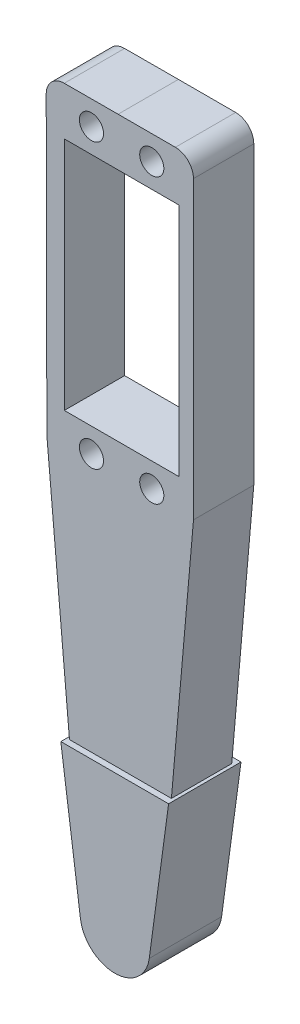
ISO-10303-21;
HEADER;
FILE_DESCRIPTION(('STEP AP214'),'2;1');
FILE_NAME('part.step','',(''),(''),'','','');
FILE_SCHEMA(('AUTOMOTIVE_DESIGN { 1 0 10303 214 1 1 1 1 }'));
ENDSEC;
DATA;
#1=APPLICATION_CONTEXT('core data for automotive mechanical design processes');
#2=APPLICATION_PROTOCOL_DEFINITION('international standard','automotive_design',2000,#1);
#3=PRODUCT_CONTEXT('',#1,'mechanical');
#4=PRODUCT('Part','Part','',(#3));
#5=PRODUCT_RELATED_PRODUCT_CATEGORY('part','',(#4));
#6=PRODUCT_DEFINITION_FORMATION('','',#4);
#7=PRODUCT_DEFINITION_CONTEXT('part definition',#1,'design');
#8=PRODUCT_DEFINITION('design','',#6,#7);
#9=PRODUCT_DEFINITION_SHAPE('','',#8);
#10=(LENGTH_UNIT() NAMED_UNIT(*) SI_UNIT(.MILLI.,.METRE.));
#11=(NAMED_UNIT(*) PLANE_ANGLE_UNIT() SI_UNIT($,.RADIAN.));
#12=(NAMED_UNIT(*) SI_UNIT($,.STERADIAN.) SOLID_ANGLE_UNIT());
#13=UNCERTAINTY_MEASURE_WITH_UNIT(LENGTH_MEASURE(1.E-05),#10,'distance_accuracy_value','');
#14=(GEOMETRIC_REPRESENTATION_CONTEXT(3) GLOBAL_UNCERTAINTY_ASSIGNED_CONTEXT((#13)) GLOBAL_UNIT_ASSIGNED_CONTEXT((#10,
#11,#12)) REPRESENTATION_CONTEXT('',''));
#15=CARTESIAN_POINT('',(0.,0.,0.));
#16=DIRECTION('',(0.,0.,1.));
#17=DIRECTION('',(1.,0.,0.));
#18=AXIS2_PLACEMENT_3D('',#15,#16,#17);
#19=CARTESIAN_POINT('',(-0.119876158686306,-36.6490933492978,11.));
#20=DIRECTION('',(0.,0.,1.));
#21=DIRECTION('',(1.,0.,0.));
#22=AXIS2_PLACEMENT_3D('',#19,#20,#21);
#23=CYLINDRICAL_SURFACE('',#22,5.75557155102982);
#24=DIRECTION('',(0.,0.,1.));
#25=VECTOR('',#24,1.);
#26=CARTESIAN_POINT('',(5.58414207070254,-37.41771543968,-0.999999999999997));
#27=LINE('',#26,#25);
#28=CARTESIAN_POINT('',(5.58414207070254,-37.41771543968,11.));
#29=VERTEX_POINT('',#28);
#30=CARTESIAN_POINT('',(5.58414207070254,-37.41771543968,-0.999999999999997));
#31=VERTEX_POINT('',#30);
#32=EDGE_CURVE('E388',#29,#31,#27,.F.);
#33=ORIENTED_EDGE('',*,*,#32,.F.);
#34=CARTESIAN_POINT('',(-0.119876158686306,-36.6490933492978,11.));
#35=DIRECTION('',(0.,0.,1.));
#36=DIRECTION('',(1.,0.,0.));
#37=AXIS2_PLACEMENT_3D('',#34,#35,#36);
#38=CIRCLE('',#37,5.75557155102982);
#39=CARTESIAN_POINT('',(-5.82234205049338,-37.4291488805267,11.));
#40=VERTEX_POINT('',#39);
#41=EDGE_CURVE('E53',#40,#29,#38,.T.);
#42=ORIENTED_EDGE('',*,*,#41,.F.);
#43=DIRECTION('',(0.,0.,1.));
#44=VECTOR('',#43,1.);
#45=CARTESIAN_POINT('',(-5.82234205049338,-37.4291488805267,-0.999999999999997));
#46=LINE('',#45,#44);
#47=CARTESIAN_POINT('',(-5.82234205049338,-37.4291488805267,-0.999999999999997));
#48=VERTEX_POINT('',#47);
#49=EDGE_CURVE('E173',#48,#40,#46,.T.);
#50=ORIENTED_EDGE('',*,*,#49,.F.);
#51=CARTESIAN_POINT('',(-0.119876158686306,-36.6490933492978,-0.999999999999997));
#52=DIRECTION('',(0.,0.,1.));
#53=DIRECTION('',(1.,0.,0.));
#54=AXIS2_PLACEMENT_3D('',#51,#52,#53);
#55=CIRCLE('',#54,5.75557155102982);
#56=EDGE_CURVE('E12',#31,#48,#55,.F.);
#57=ORIENTED_EDGE('',*,*,#56,.F.);
#58=EDGE_LOOP('',(#33,#42,#50,#57));
#59=FACE_BOUND('',#58,.T.);
#60=ADVANCED_FACE('F44',(#59),#23,.T.);
#61=CARTESIAN_POINT('',(-12.3962223816883,28.2063602855592,10.));
#62=DIRECTION('',(0.995999856134948,0.0893548352310192,0.));
#63=DIRECTION('',(-0.0893548352310192,0.995999856134948,0.));
#64=AXIS2_PLACEMENT_3D('',#61,#62,#63);
#65=PLANE('',#64);
#66=DIRECTION('',(0.,0.,-1.));
#67=VECTOR('',#66,1.);
#68=CARTESIAN_POINT('',(-8.64494350631588,-13.6075293661105,10.));
#69=LINE('',#68,#67);
#70=CARTESIAN_POINT('',(-8.64494350631588,-13.6075293661105,10.));
#71=VERTEX_POINT('',#70);
#72=CARTESIAN_POINT('',(-8.64494350631588,-13.6075293661105,0.));
#73=VERTEX_POINT('',#72);
#74=EDGE_CURVE('E209',#71,#73,#69,.T.);
#75=ORIENTED_EDGE('',*,*,#74,.F.);
#76=DIRECTION('',(0.0893548352310192,-0.995999856134948,0.));
#77=VECTOR('',#76,1.);
#78=CARTESIAN_POINT('',(-12.3962223816883,28.2063602855592,10.));
#79=LINE('',#78,#77);
#80=CARTESIAN_POINT('',(-12.3962223816883,28.2063602855592,10.));
#81=VERTEX_POINT('',#80);
#82=EDGE_CURVE('E273',#81,#71,#79,.T.);
#83=ORIENTED_EDGE('',*,*,#82,.F.);
#84=DIRECTION('',(0.,0.,-1.));
#85=VECTOR('',#84,1.);
#86=CARTESIAN_POINT('',(-12.3962223816883,28.2063602855592,10.));
#87=LINE('',#86,#85);
#88=CARTESIAN_POINT('',(-12.3962223816883,28.2063602855592,0.));
#89=VERTEX_POINT('',#88);
#90=EDGE_CURVE('E324',#81,#89,#87,.T.);
#91=ORIENTED_EDGE('',*,*,#90,.T.);
#92=DIRECTION('',(0.0893548352310192,-0.995999856134948,0.));
#93=VECTOR('',#92,1.);
#94=CARTESIAN_POINT('',(-12.3962223816883,28.2063602855592,0.));
#95=LINE('',#94,#93);
#96=EDGE_CURVE('E297',#89,#73,#95,.T.);
#97=ORIENTED_EDGE('',*,*,#96,.T.);
#98=EDGE_LOOP('',(#75,#83,#91,#97));
#99=FACE_BOUND('',#98,.T.);
#100=ADVANCED_FACE('F409',(#99),#65,.F.);
#101=CARTESIAN_POINT('',(8.2576731166749,-13.6069774393073,10.));
#102=DIRECTION('',(-0.0011038536065263,0.999999390753422,0.));
#103=DIRECTION('',(-0.999999390753422,-0.0011038536065263,0.));
#104=AXIS2_PLACEMENT_3D('',#101,#102,#103);
#105=PLANE('',#104);
#106=DIRECTION('',(0.,0.,1.));
#107=VECTOR('',#106,1.);
#108=CARTESIAN_POINT('',(7.75767342129897,-13.6075293661105,10.));
#109=LINE('',#108,#107);
#110=CARTESIAN_POINT('',(7.75767342080739,-13.6075293661108,0.));
#111=VERTEX_POINT('',#110);
#112=CARTESIAN_POINT('',(7.75767342080739,-13.6075293661108,10.));
#113=VERTEX_POINT('',#112);
#114=EDGE_CURVE('E186',#111,#113,#109,.T.);
#115=ORIENTED_EDGE('',*,*,#114,.F.);
#116=DIRECTION('',(0.999999390753422,0.0011038536065263,0.));
#117=VECTOR('',#116,1.);
#118=CARTESIAN_POINT('',(8.2576731166749,-13.6069774393073,0.));
#119=LINE('',#118,#117);
#120=CARTESIAN_POINT('',(8.2576731166749,-13.6069774393073,0.));
#121=VERTEX_POINT('',#120);
#122=EDGE_CURVE('E301',#111,#121,#119,.T.);
#123=ORIENTED_EDGE('',*,*,#122,.T.);
#124=DIRECTION('',(0.,0.,-1.));
#125=VECTOR('',#124,1.);
#126=CARTESIAN_POINT('',(8.2576731166749,-13.6069774393073,10.));
#127=LINE('',#126,#125);
#128=CARTESIAN_POINT('',(8.2576731166749,-13.6069774393073,10.));
#129=VERTEX_POINT('',#128);
#130=EDGE_CURVE('E320',#129,#121,#127,.T.);
#131=ORIENTED_EDGE('',*,*,#130,.F.);
#132=DIRECTION('',(0.999999390753422,0.0011038536065263,0.));
#133=VECTOR('',#132,1.);
#134=CARTESIAN_POINT('',(8.2576731166749,-13.6069774393073,10.));
#135=LINE('',#134,#133);
#136=EDGE_CURVE('E277',#113,#129,#135,.T.);
#137=ORIENTED_EDGE('',*,*,#136,.F.);
#138=EDGE_LOOP('',(#115,#123,#131,#137));
#139=FACE_BOUND('',#138,.T.);
#140=ADVANCED_FACE('F413',(#139),#105,.F.);
#141=CARTESIAN_POINT('',(0.,0.,10.));
#142=DIRECTION('',(0.,0.,1.));
#143=DIRECTION('',(1.,0.,0.));
#144=AXIS2_PLACEMENT_3D('',#141,#142,#143);
#145=PLANE('',#144);
#146=CARTESIAN_POINT('',(-5.,76.233199880546,10.));
#147=DIRECTION('',(0.,0.,1.));
#148=DIRECTION('',(1.,0.,0.));
#149=AXIS2_PLACEMENT_3D('',#146,#147,#148);
#150=CIRCLE('',#149,2.);
#151=CARTESIAN_POINT('',(-3.,76.233199880546,10.));
#152=VERTEX_POINT('',#151);
#153=EDGE_CURVE('E232',#152,#152,#150,.T.);
#154=ORIENTED_EDGE('',*,*,#153,.F.);
#155=EDGE_LOOP('',(#154));
#156=FACE_BOUND('',#155,.T.);
#157=CARTESIAN_POINT('',(-4.99999999999999,29.2331998805461,10.));
#158=DIRECTION('',(0.,0.,1.));
#159=DIRECTION('',(1.,0.,0.));
#160=AXIS2_PLACEMENT_3D('',#157,#158,#159);
#161=CIRCLE('',#160,2.);
#162=CARTESIAN_POINT('',(-2.99999999999999,29.2331998805461,10.));
#163=VERTEX_POINT('',#162);
#164=EDGE_CURVE('E227',#163,#163,#161,.T.);
#165=ORIENTED_EDGE('',*,*,#164,.F.);
#166=EDGE_LOOP('',(#165));
#167=FACE_BOUND('',#166,.T.);
#168=CARTESIAN_POINT('',(5.00000000000001,29.233199880546,10.));
#169=DIRECTION('',(0.,0.,1.));
#170=DIRECTION('',(1.,0.,0.));
#171=AXIS2_PLACEMENT_3D('',#168,#169,#170);
#172=CIRCLE('',#171,2.);
#173=CARTESIAN_POINT('',(7.00000000000001,29.233199880546,10.));
#174=VERTEX_POINT('',#173);
#175=EDGE_CURVE('E222',#174,#174,#172,.T.);
#176=ORIENTED_EDGE('',*,*,#175,.F.);
#177=EDGE_LOOP('',(#176));
#178=FACE_BOUND('',#177,.T.);
#179=CARTESIAN_POINT('',(5.,76.233199880546,10.));
#180=DIRECTION('',(0.,0.,1.));
#181=DIRECTION('',(1.,0.,0.));
#182=AXIS2_PLACEMENT_3D('',#179,#180,#181);
#183=CIRCLE('',#182,2.);
#184=CARTESIAN_POINT('',(7.,76.233199880546,10.));
#185=VERTEX_POINT('',#184);
#186=EDGE_CURVE('E217',#185,#185,#183,.T.);
#187=ORIENTED_EDGE('',*,*,#186,.F.);
#188=EDGE_LOOP('',(#187));
#189=FACE_BOUND('',#188,.T.);
#190=DIRECTION('',(0.,-1.,0.));
#191=VECTOR('',#190,1.);
#192=CARTESIAN_POINT('',(-9.5,72.233199880546,10.));
#193=LINE('',#192,#191);
#194=CARTESIAN_POINT('',(-9.5,72.233199880546,10.));
#195=VERTEX_POINT('',#194);
#196=CARTESIAN_POINT('',(-9.49999999999999,33.233199880546,10.));
#197=VERTEX_POINT('',#196);
#198=EDGE_CURVE('E236',#195,#197,#193,.T.);
#199=ORIENTED_EDGE('',*,*,#198,.F.);
#200=DIRECTION('',(-1.,0.,0.));
#201=VECTOR('',#200,1.);
#202=CARTESIAN_POINT('',(-9.5,72.233199880546,10.));
#203=LINE('',#202,#201);
#204=CARTESIAN_POINT('',(9.5,72.233199880546,10.));
#205=VERTEX_POINT('',#204);
#206=EDGE_CURVE('E247',#205,#195,#203,.T.);
#207=ORIENTED_EDGE('',*,*,#206,.F.);
#208=DIRECTION('',(0.,1.,0.));
#209=VECTOR('',#208,1.);
#210=CARTESIAN_POINT('',(9.5,72.233199880546,10.));
#211=LINE('',#210,#209);
#212=CARTESIAN_POINT('',(9.50000000000001,33.233199880546,10.));
#213=VERTEX_POINT('',#212);
#214=EDGE_CURVE('E243',#213,#205,#211,.T.);
#215=ORIENTED_EDGE('',*,*,#214,.F.);
#216=DIRECTION('',(1.,0.,0.));
#217=VECTOR('',#216,1.);
#218=CARTESIAN_POINT('',(-9.49999999999999,33.233199880546,10.));
#219=LINE('',#218,#217);
#220=EDGE_CURVE('E239',#197,#213,#219,.T.);
#221=ORIENTED_EDGE('',*,*,#220,.F.);
#222=EDGE_LOOP('',(#199,#207,#215,#221));
#223=FACE_BOUND('',#222,.T.);
#224=ORIENTED_EDGE('',*,*,#82,.T.);
#225=DIRECTION('',(1.,0.,0.));
#226=VECTOR('',#225,1.);
#227=CARTESIAN_POINT('',(0.,-13.6075293661105,10.));
#228=LINE('',#227,#226);
#229=EDGE_CURVE('E213',#71,#113,#228,.T.);
#230=ORIENTED_EDGE('',*,*,#229,.T.);
#231=ORIENTED_EDGE('',*,*,#136,.T.);
#232=DIRECTION('',(0.0871557427476583,0.996194698091745,0.));
#233=VECTOR('',#232,1.);
#234=CARTESIAN_POINT('',(11.9182143120765,28.233199880546,10.));
#235=LINE('',#234,#233);
#236=CARTESIAN_POINT('',(11.9182143120765,28.233199880546,10.));
#237=VERTEX_POINT('',#236);
#238=EDGE_CURVE('E280',#129,#237,#235,.T.);
#239=ORIENTED_EDGE('',*,*,#238,.T.);
#240=DIRECTION('',(0.,1.,0.));
#241=VECTOR('',#240,1.);
#242=CARTESIAN_POINT('',(11.9182143120765,80.233199880546,10.));
#243=LINE('',#242,#241);
#244=CARTESIAN_POINT('',(11.9182143120765,77.233199880546,10.));
#245=VERTEX_POINT('',#244);
#246=EDGE_CURVE('E283',#237,#245,#243,.T.);
#247=ORIENTED_EDGE('',*,*,#246,.T.);
#248=CARTESIAN_POINT('',(8.91821431207654,77.233199880546,10.));
#249=DIRECTION('',(0.,0.,1.));
#250=DIRECTION('',(1.,0.,0.));
#251=AXIS2_PLACEMENT_3D('',#248,#249,#250);
#252=CIRCLE('',#251,3.);
#253=CARTESIAN_POINT('',(8.91821431207654,80.233199880546,10.));
#254=VERTEX_POINT('',#253);
#255=EDGE_CURVE('E364',#245,#254,#252,.T.);
#256=ORIENTED_EDGE('',*,*,#255,.T.);
#257=DIRECTION('',(-1.,0.,0.));
#258=VECTOR('',#257,1.);
#259=CARTESIAN_POINT('',(-0.581785687923459,80.233199880546,10.));
#260=LINE('',#259,#258);
#261=CARTESIAN_POINT('',(-0.581785687923459,80.233199880546,10.));
#262=VERTEX_POINT('',#261);
#263=EDGE_CURVE('E287',#254,#262,#260,.T.);
#264=ORIENTED_EDGE('',*,*,#263,.T.);
#265=DIRECTION('',(-0.999997445027159,-0.00226051745275021,0.));
#266=VECTOR('',#265,1.);
#267=CARTESIAN_POINT('',(-0.581785687923459,80.233199880546,10.));
#268=LINE('',#267,#266);
#269=CARTESIAN_POINT('',(-9.51118918230423,80.2130147565319,10.));
#270=VERTEX_POINT('',#269);
#271=EDGE_CURVE('E265',#262,#270,#268,.T.);
#272=ORIENTED_EDGE('',*,*,#271,.T.);
#273=CARTESIAN_POINT('',(-9.50440762994598,77.2130224214504,10.));
#274=DIRECTION('',(0.,0.,1.));
#275=DIRECTION('',(1.,0.,0.));
#276=AXIS2_PLACEMENT_3D('',#273,#274,#275);
#277=CIRCLE('',#276,3.);
#278=CARTESIAN_POINT('',(-12.5044003189893,77.2063993038464,10.));
#279=VERTEX_POINT('',#278);
#280=EDGE_CURVE('E381',#270,#279,#277,.T.);
#281=ORIENTED_EDGE('',*,*,#280,.T.);
#282=DIRECTION('',(0.0022077058680007,-0.999997563014431,0.));
#283=VECTOR('',#282,1.);
#284=CARTESIAN_POINT('',(-12.5110230868243,80.2062335623096,10.));
#285=LINE('',#284,#283);
#286=EDGE_CURVE('E269',#279,#81,#285,.T.);
#287=ORIENTED_EDGE('',*,*,#286,.T.);
#288=EDGE_LOOP('',(#224,#230,#231,#239,#247,#256,#264,#272,#281,#287));
#289=FACE_BOUND('',#288,.T.);
#290=ADVANCED_FACE('F419',(#156,#167,#178,#189,#223,#289),#145,.T.);
#291=CARTESIAN_POINT('',(0.,0.,0.));
#292=DIRECTION('',(0.,0.,1.));
#293=DIRECTION('',(1.,0.,0.));
#294=AXIS2_PLACEMENT_3D('',#291,#292,#293);
#295=PLANE('',#294);
#296=DIRECTION('',(-1.,0.,0.));
#297=VECTOR('',#296,1.);
#298=CARTESIAN_POINT('',(0.,72.233199880546,0.));
#299=LINE('',#298,#297);
#300=CARTESIAN_POINT('',(9.5,72.233199880546,0.));
#301=VERTEX_POINT('',#300);
#302=CARTESIAN_POINT('',(-9.5,72.233199880546,0.));
#303=VERTEX_POINT('',#302);
#304=EDGE_CURVE('E336',#301,#303,#299,.T.);
#305=ORIENTED_EDGE('',*,*,#304,.T.);
#306=DIRECTION('',(0.,-1.,0.));
#307=VECTOR('',#306,1.);
#308=CARTESIAN_POINT('',(-9.49999999999999,0.,0.));
#309=LINE('',#308,#307);
#310=CARTESIAN_POINT('',(-9.49999999999999,33.233199880546,0.));
#311=VERTEX_POINT('',#310);
#312=EDGE_CURVE('E340',#303,#311,#309,.T.);
#313=ORIENTED_EDGE('',*,*,#312,.T.);
#314=DIRECTION('',(1.,0.,0.));
#315=VECTOR('',#314,1.);
#316=CARTESIAN_POINT('',(0.,33.233199880546,0.));
#317=LINE('',#316,#315);
#318=CARTESIAN_POINT('',(9.50000000000001,33.233199880546,0.));
#319=VERTEX_POINT('',#318);
#320=EDGE_CURVE('E328',#311,#319,#317,.T.);
#321=ORIENTED_EDGE('',*,*,#320,.T.);
#322=DIRECTION('',(0.,1.,0.));
#323=VECTOR('',#322,1.);
#324=CARTESIAN_POINT('',(9.50000000000001,0.,0.));
#325=LINE('',#324,#323);
#326=EDGE_CURVE('E332',#319,#301,#325,.T.);
#327=ORIENTED_EDGE('',*,*,#326,.T.);
#328=EDGE_LOOP('',(#305,#313,#321,#327));
#329=FACE_BOUND('',#328,.T.);
#330=CARTESIAN_POINT('',(5.,76.233199880546,0.));
#331=DIRECTION('',(0.,0.,1.));
#332=DIRECTION('',(1.,0.,0.));
#333=AXIS2_PLACEMENT_3D('',#330,#331,#332);
#334=CIRCLE('',#333,2.);
#335=CARTESIAN_POINT('',(7.,76.233199880546,0.));
#336=VERTEX_POINT('',#335);
#337=EDGE_CURVE('E216',#336,#336,#334,.T.);
#338=ORIENTED_EDGE('',*,*,#337,.T.);
#339=EDGE_LOOP('',(#338));
#340=FACE_BOUND('',#339,.T.);
#341=CARTESIAN_POINT('',(5.00000000000001,29.233199880546,0.));
#342=DIRECTION('',(0.,0.,1.));
#343=DIRECTION('',(1.,0.,0.));
#344=AXIS2_PLACEMENT_3D('',#341,#342,#343);
#345=CIRCLE('',#344,2.);
#346=CARTESIAN_POINT('',(7.00000000000001,29.233199880546,0.));
#347=VERTEX_POINT('',#346);
#348=EDGE_CURVE('E221',#347,#347,#345,.T.);
#349=ORIENTED_EDGE('',*,*,#348,.T.);
#350=EDGE_LOOP('',(#349));
#351=FACE_BOUND('',#350,.T.);
#352=CARTESIAN_POINT('',(-4.99999999999999,29.2331998805461,0.));
#353=DIRECTION('',(0.,0.,1.));
#354=DIRECTION('',(1.,0.,0.));
#355=AXIS2_PLACEMENT_3D('',#352,#353,#354);
#356=CIRCLE('',#355,2.);
#357=CARTESIAN_POINT('',(-2.99999999999999,29.2331998805461,0.));
#358=VERTEX_POINT('',#357);
#359=EDGE_CURVE('E226',#358,#358,#356,.T.);
#360=ORIENTED_EDGE('',*,*,#359,.T.);
#361=EDGE_LOOP('',(#360));
#362=FACE_BOUND('',#361,.T.);
#363=CARTESIAN_POINT('',(-5.,76.233199880546,0.));
#364=DIRECTION('',(0.,0.,1.));
#365=DIRECTION('',(1.,0.,0.));
#366=AXIS2_PLACEMENT_3D('',#363,#364,#365);
#367=CIRCLE('',#366,2.);
#368=CARTESIAN_POINT('',(-3.,76.233199880546,0.));
#369=VERTEX_POINT('',#368);
#370=EDGE_CURVE('E231',#369,#369,#367,.T.);
#371=ORIENTED_EDGE('',*,*,#370,.T.);
#372=EDGE_LOOP('',(#371));
#373=FACE_BOUND('',#372,.T.);
#374=DIRECTION('',(1.,0.,0.));
#375=VECTOR('',#374,1.);
#376=CARTESIAN_POINT('',(0.,-13.6075293661105,0.));
#377=LINE('',#376,#375);
#378=EDGE_CURVE('E384',#73,#111,#377,.T.);
#379=ORIENTED_EDGE('',*,*,#378,.F.);
#380=ORIENTED_EDGE('',*,*,#96,.F.);
#381=DIRECTION('',(0.0022077058680007,-0.999997563014431,0.));
#382=VECTOR('',#381,1.);
#383=CARTESIAN_POINT('',(-12.5110230868243,80.2062335623096,0.));
#384=LINE('',#383,#382);
#385=CARTESIAN_POINT('',(-12.5044003189893,77.2063993038464,0.));
#386=VERTEX_POINT('',#385);
#387=EDGE_CURVE('E294',#386,#89,#384,.T.);
#388=ORIENTED_EDGE('',*,*,#387,.F.);
#389=CARTESIAN_POINT('',(-9.50440762994598,77.2130224214504,0.));
#390=DIRECTION('',(0.,0.,1.));
#391=DIRECTION('',(1.,0.,0.));
#392=AXIS2_PLACEMENT_3D('',#389,#390,#391);
#393=CIRCLE('',#392,3.);
#394=CARTESIAN_POINT('',(-9.51118918230423,80.2130147565319,0.));
#395=VERTEX_POINT('',#394);
#396=EDGE_CURVE('E378',#386,#395,#393,.F.);
#397=ORIENTED_EDGE('',*,*,#396,.T.);
#398=DIRECTION('',(-0.999997445027159,-0.00226051745275021,0.));
#399=VECTOR('',#398,1.);
#400=CARTESIAN_POINT('',(-0.581785687923459,80.233199880546,0.));
#401=LINE('',#400,#399);
#402=CARTESIAN_POINT('',(-0.581785687923459,80.233199880546,0.));
#403=VERTEX_POINT('',#402);
#404=EDGE_CURVE('E255',#403,#395,#401,.T.);
#405=ORIENTED_EDGE('',*,*,#404,.F.);
#406=DIRECTION('',(-1.,0.,0.));
#407=VECTOR('',#406,1.);
#408=CARTESIAN_POINT('',(-0.581785687923459,80.233199880546,0.));
#409=LINE('',#408,#407);
#410=CARTESIAN_POINT('',(8.91821431207654,80.233199880546,0.));
#411=VERTEX_POINT('',#410);
#412=EDGE_CURVE('E270',#411,#403,#409,.T.);
#413=ORIENTED_EDGE('',*,*,#412,.F.);
#414=CARTESIAN_POINT('',(8.91821431207654,77.233199880546,0.));
#415=DIRECTION('',(0.,0.,1.));
#416=DIRECTION('',(1.,0.,0.));
#417=AXIS2_PLACEMENT_3D('',#414,#415,#416);
#418=CIRCLE('',#417,3.);
#419=CARTESIAN_POINT('',(11.9182143120765,77.233199880546,0.));
#420=VERTEX_POINT('',#419);
#421=EDGE_CURVE('E367',#411,#420,#418,.F.);
#422=ORIENTED_EDGE('',*,*,#421,.T.);
#423=DIRECTION('',(0.,1.,0.));
#424=VECTOR('',#423,1.);
#425=CARTESIAN_POINT('',(11.9182143120765,80.233199880546,0.));
#426=LINE('',#425,#424);
#427=CARTESIAN_POINT('',(11.9182143120765,28.233199880546,0.));
#428=VERTEX_POINT('',#427);
#429=EDGE_CURVE('E307',#428,#420,#426,.T.);
#430=ORIENTED_EDGE('',*,*,#429,.F.);
#431=DIRECTION('',(0.0871557427476583,0.996194698091745,0.));
#432=VECTOR('',#431,1.);
#433=CARTESIAN_POINT('',(11.9182143120765,28.233199880546,0.));
#434=LINE('',#433,#432);
#435=EDGE_CURVE('E304',#121,#428,#434,.T.);
#436=ORIENTED_EDGE('',*,*,#435,.F.);
#437=ORIENTED_EDGE('',*,*,#122,.F.);
#438=EDGE_LOOP('',(#379,#380,#388,#397,#405,#413,#422,#430,#436,#437));
#439=FACE_BOUND('',#438,.T.);
#440=ADVANCED_FACE('F438',(#329,#340,#351,#362,#373,#439),#295,.F.);
#441=CARTESIAN_POINT('',(-9.50440762994598,77.2130224214504,10.));
#442=DIRECTION('',(0.,0.,1.));
#443=DIRECTION('',(1.,0.,0.));
#444=AXIS2_PLACEMENT_3D('',#441,#442,#443);
#445=CYLINDRICAL_SURFACE('',#444,3.);
#446=DIRECTION('',(0.,0.,1.));
#447=VECTOR('',#446,1.);
#448=CARTESIAN_POINT('',(-9.51118918230423,80.2130147565319,10.));
#449=LINE('',#448,#447);
#450=EDGE_CURVE('E370',#395,#270,#449,.T.);
#451=ORIENTED_EDGE('',*,*,#450,.F.);
#452=ORIENTED_EDGE('',*,*,#396,.F.);
#453=DIRECTION('',(0.,0.,1.));
#454=VECTOR('',#453,1.);
#455=CARTESIAN_POINT('',(-12.5044003189893,77.2063993038464,10.));
#456=LINE('',#455,#454);
#457=EDGE_CURVE('E374',#279,#386,#456,.F.);
#458=ORIENTED_EDGE('',*,*,#457,.F.);
#459=ORIENTED_EDGE('',*,*,#280,.F.);
#460=EDGE_LOOP('',(#451,#452,#458,#459));
#461=FACE_BOUND('',#460,.T.);
#462=ADVANCED_FACE('F435',(#461),#445,.T.);
#463=CARTESIAN_POINT('',(8.91821431207654,77.233199880546,10.));
#464=DIRECTION('',(0.,0.,-1.));
#465=DIRECTION('',(-1.,0.,0.));
#466=AXIS2_PLACEMENT_3D('',#463,#464,#465);
#467=CYLINDRICAL_SURFACE('',#466,3.);
#468=DIRECTION('',(0.,0.,-1.));
#469=VECTOR('',#468,1.);
#470=CARTESIAN_POINT('',(8.91821431207654,80.233199880546,10.));
#471=LINE('',#470,#469);
#472=EDGE_CURVE('E344',#254,#411,#471,.T.);
#473=ORIENTED_EDGE('',*,*,#472,.F.);
#474=ORIENTED_EDGE('',*,*,#255,.F.);
#475=DIRECTION('',(0.,0.,-1.));
#476=VECTOR('',#475,1.);
#477=CARTESIAN_POINT('',(11.9182143120765,77.233199880546,10.));
#478=LINE('',#477,#476);
#479=EDGE_CURVE('E360',#420,#245,#478,.F.);
#480=ORIENTED_EDGE('',*,*,#479,.F.);
#481=ORIENTED_EDGE('',*,*,#421,.F.);
#482=EDGE_LOOP('',(#473,#474,#480,#481));
#483=FACE_BOUND('',#482,.T.);
#484=ADVANCED_FACE('F432',(#483),#467,.T.);
#485=CARTESIAN_POINT('',(-0.581785687923459,80.233199880546,10.));
#486=DIRECTION('',(0.00226051745275021,-0.999997445027159,0.));
#487=DIRECTION('',(0.999997445027159,0.00226051745275021,0.));
#488=AXIS2_PLACEMENT_3D('',#485,#486,#487);
#489=PLANE('',#488);
#490=ORIENTED_EDGE('',*,*,#404,.T.);
#491=ORIENTED_EDGE('',*,*,#450,.T.);
#492=ORIENTED_EDGE('',*,*,#271,.F.);
#493=DIRECTION('',(0.,0.,-1.));
#494=VECTOR('',#493,1.);
#495=CARTESIAN_POINT('',(-0.581785687923459,80.233199880546,10.));
#496=LINE('',#495,#494);
#497=EDGE_CURVE('E290',#262,#403,#496,.T.);
#498=ORIENTED_EDGE('',*,*,#497,.T.);
#499=EDGE_LOOP('',(#490,#491,#492,#498));
#500=FACE_BOUND('',#499,.T.);
#501=ADVANCED_FACE('F428',(#500),#489,.F.);
#502=CARTESIAN_POINT('',(-12.5110230868243,80.2062335623096,10.));
#503=DIRECTION('',(0.999997563014431,0.0022077058680007,0.));
#504=DIRECTION('',(-0.0022077058680007,0.999997563014431,0.));
#505=AXIS2_PLACEMENT_3D('',#502,#503,#504);
#506=PLANE('',#505);
#507=ORIENTED_EDGE('',*,*,#286,.F.);
#508=ORIENTED_EDGE('',*,*,#457,.T.);
#509=ORIENTED_EDGE('',*,*,#387,.T.);
#510=ORIENTED_EDGE('',*,*,#90,.F.);
#511=EDGE_LOOP('',(#507,#508,#509,#510));
#512=FACE_BOUND('',#511,.T.);
#513=ADVANCED_FACE('F424',(#512),#506,.F.);
#514=CARTESIAN_POINT('',(11.9182143120765,28.233199880546,10.));
#515=DIRECTION('',(-0.996194698091746,0.0871557427476584,0.));
#516=DIRECTION('',(-0.0871557427476584,-0.996194698091746,0.));
#517=AXIS2_PLACEMENT_3D('',#514,#515,#516);
#518=PLANE('',#517);
#519=ORIENTED_EDGE('',*,*,#435,.T.);
#520=DIRECTION('',(0.,0.,-1.));
#521=VECTOR('',#520,1.);
#522=CARTESIAN_POINT('',(11.9182143120765,28.233199880546,10.));
#523=LINE('',#522,#521);
#524=EDGE_CURVE('E316',#237,#428,#523,.T.);
#525=ORIENTED_EDGE('',*,*,#524,.F.);
#526=ORIENTED_EDGE('',*,*,#238,.F.);
#527=ORIENTED_EDGE('',*,*,#130,.T.);
#528=EDGE_LOOP('',(#519,#525,#526,#527));
#529=FACE_BOUND('',#528,.T.);
#530=ADVANCED_FACE('F427',(#529),#518,.F.);
#531=CARTESIAN_POINT('',(11.9182143120765,80.233199880546,10.));
#532=DIRECTION('',(-1.,0.,0.));
#533=DIRECTION('',(0.,-1.,0.));
#534=AXIS2_PLACEMENT_3D('',#531,#532,#533);
#535=PLANE('',#534);
#536=ORIENTED_EDGE('',*,*,#429,.T.);
#537=ORIENTED_EDGE('',*,*,#479,.T.);
#538=ORIENTED_EDGE('',*,*,#246,.F.);
#539=ORIENTED_EDGE('',*,*,#524,.T.);
#540=EDGE_LOOP('',(#536,#537,#538,#539));
#541=FACE_BOUND('',#540,.T.);
#542=ADVANCED_FACE('F469',(#541),#535,.F.);
#543=CARTESIAN_POINT('',(-0.581785687923459,80.233199880546,10.));
#544=DIRECTION('',(0.,-1.,0.));
#545=DIRECTION('',(0.,0.,-1.));
#546=AXIS2_PLACEMENT_3D('',#543,#544,#545);
#547=PLANE('',#546);
#548=ORIENTED_EDGE('',*,*,#263,.F.);
#549=ORIENTED_EDGE('',*,*,#472,.T.);
#550=ORIENTED_EDGE('',*,*,#412,.T.);
#551=ORIENTED_EDGE('',*,*,#497,.F.);
#552=EDGE_LOOP('',(#548,#549,#550,#551));
#553=FACE_BOUND('',#552,.T.);
#554=ADVANCED_FACE('F474',(#553),#547,.F.);
#555=CARTESIAN_POINT('',(-9.5,72.233199880546,-4.));
#556=DIRECTION('',(-1.,0.,0.));
#557=DIRECTION('',(0.,-1.,0.));
#558=AXIS2_PLACEMENT_3D('',#555,#556,#557);
#559=PLANE('',#558);
#560=DIRECTION('',(0.,0.,1.));
#561=VECTOR('',#560,1.);
#562=CARTESIAN_POINT('',(-9.5,72.233199880546,-4.));
#563=LINE('',#562,#561);
#564=EDGE_CURVE('E252',#303,#195,#563,.T.);
#565=ORIENTED_EDGE('',*,*,#564,.T.);
#566=ORIENTED_EDGE('',*,*,#198,.T.);
#567=DIRECTION('',(0.,0.,1.));
#568=VECTOR('',#567,1.);
#569=CARTESIAN_POINT('',(-9.49999999999999,33.233199880546,-4.));
#570=LINE('',#569,#568);
#571=EDGE_CURVE('E251',#311,#197,#570,.T.);
#572=ORIENTED_EDGE('',*,*,#571,.F.);
#573=ORIENTED_EDGE('',*,*,#312,.F.);
#574=EDGE_LOOP('',(#565,#566,#572,#573));
#575=FACE_BOUND('',#574,.T.);
#576=ADVANCED_FACE('F476',(#575),#559,.F.);
#577=CARTESIAN_POINT('',(-9.5,72.233199880546,-4.));
#578=DIRECTION('',(0.,1.,0.));
#579=DIRECTION('',(0.,0.,1.));
#580=AXIS2_PLACEMENT_3D('',#577,#578,#579);
#581=PLANE('',#580);
#582=DIRECTION('',(0.,0.,1.));
#583=VECTOR('',#582,1.);
#584=CARTESIAN_POINT('',(9.5,72.233199880546,-4.));
#585=LINE('',#584,#583);
#586=EDGE_CURVE('E256',#301,#205,#585,.T.);
#587=ORIENTED_EDGE('',*,*,#586,.T.);
#588=ORIENTED_EDGE('',*,*,#206,.T.);
#589=ORIENTED_EDGE('',*,*,#564,.F.);
#590=ORIENTED_EDGE('',*,*,#304,.F.);
#591=EDGE_LOOP('',(#587,#588,#589,#590));
#592=FACE_BOUND('',#591,.T.);
#593=ADVANCED_FACE('F482',(#592),#581,.F.);
#594=CARTESIAN_POINT('',(9.5,72.233199880546,-4.));
#595=DIRECTION('',(1.,0.,0.));
#596=DIRECTION('',(0.,1.,0.));
#597=AXIS2_PLACEMENT_3D('',#594,#595,#596);
#598=PLANE('',#597);
#599=DIRECTION('',(0.,0.,1.));
#600=VECTOR('',#599,1.);
#601=CARTESIAN_POINT('',(9.50000000000001,33.233199880546,-4.));
#602=LINE('',#601,#600);
#603=EDGE_CURVE('E259',#319,#213,#602,.T.);
#604=ORIENTED_EDGE('',*,*,#603,.T.);
#605=ORIENTED_EDGE('',*,*,#214,.T.);
#606=ORIENTED_EDGE('',*,*,#586,.F.);
#607=ORIENTED_EDGE('',*,*,#326,.F.);
#608=EDGE_LOOP('',(#604,#605,#606,#607));
#609=FACE_BOUND('',#608,.T.);
#610=ADVANCED_FACE('F604',(#609),#598,.F.);
#611=CARTESIAN_POINT('',(-9.49999999999999,33.233199880546,-4.));
#612=DIRECTION('',(0.,-1.,0.));
#613=DIRECTION('',(0.,0.,-1.));
#614=AXIS2_PLACEMENT_3D('',#611,#612,#613);
#615=PLANE('',#614);
#616=ORIENTED_EDGE('',*,*,#571,.T.);
#617=ORIENTED_EDGE('',*,*,#220,.T.);
#618=ORIENTED_EDGE('',*,*,#603,.F.);
#619=ORIENTED_EDGE('',*,*,#320,.F.);
#620=EDGE_LOOP('',(#616,#617,#618,#619));
#621=FACE_BOUND('',#620,.T.);
#622=ADVANCED_FACE('F600',(#621),#615,.F.);
#623=CARTESIAN_POINT('',(5.,76.233199880546,-7.));
#624=DIRECTION('',(0.,0.,1.));
#625=DIRECTION('',(1.,0.,0.));
#626=AXIS2_PLACEMENT_3D('',#623,#624,#625);
#627=CYLINDRICAL_SURFACE('',#626,2.);
#628=ORIENTED_EDGE('',*,*,#186,.T.);
#629=EDGE_LOOP('',(#628));
#630=FACE_BOUND('',#629,.T.);
#631=ORIENTED_EDGE('',*,*,#337,.F.);
#632=EDGE_LOOP('',(#631));
#633=FACE_BOUND('',#632,.T.);
#634=ADVANCED_FACE('F591',(#630,#633),#627,.F.);
#635=CARTESIAN_POINT('',(5.00000000000001,29.233199880546,-7.));
#636=DIRECTION('',(0.,0.,1.));
#637=DIRECTION('',(1.,0.,0.));
#638=AXIS2_PLACEMENT_3D('',#635,#636,#637);
#639=CYLINDRICAL_SURFACE('',#638,2.);
#640=ORIENTED_EDGE('',*,*,#175,.T.);
#641=EDGE_LOOP('',(#640));
#642=FACE_BOUND('',#641,.T.);
#643=ORIENTED_EDGE('',*,*,#348,.F.);
#644=EDGE_LOOP('',(#643));
#645=FACE_BOUND('',#644,.T.);
#646=ADVANCED_FACE('F587',(#642,#645),#639,.F.);
#647=CARTESIAN_POINT('',(-4.99999999999999,29.2331998805461,-7.));
#648=DIRECTION('',(0.,0.,1.));
#649=DIRECTION('',(1.,0.,0.));
#650=AXIS2_PLACEMENT_3D('',#647,#648,#649);
#651=CYLINDRICAL_SURFACE('',#650,2.);
#652=ORIENTED_EDGE('',*,*,#164,.T.);
#653=EDGE_LOOP('',(#652));
#654=FACE_BOUND('',#653,.T.);
#655=ORIENTED_EDGE('',*,*,#359,.F.);
#656=EDGE_LOOP('',(#655));
#657=FACE_BOUND('',#656,.T.);
#658=ADVANCED_FACE('F590',(#654,#657),#651,.F.);
#659=CARTESIAN_POINT('',(-5.,76.233199880546,-7.));
#660=DIRECTION('',(0.,0.,1.));
#661=DIRECTION('',(1.,0.,0.));
#662=AXIS2_PLACEMENT_3D('',#659,#660,#661);
#663=CYLINDRICAL_SURFACE('',#662,2.);
#664=ORIENTED_EDGE('',*,*,#153,.T.);
#665=EDGE_LOOP('',(#664));
#666=FACE_BOUND('',#665,.T.);
#667=ORIENTED_EDGE('',*,*,#370,.F.);
#668=EDGE_LOOP('',(#667));
#669=FACE_BOUND('',#668,.T.);
#670=ADVANCED_FACE('F567',(#666,#669),#663,.F.);
#671=CARTESIAN_POINT('',(4.91214570517129,-42.4046649003277,-0.999999999999997));
#672=DIRECTION('',(-0.991042884067396,0.133544007500813,0.));
#673=DIRECTION('',(-0.133544007500813,-0.991042884067396,0.));
#674=AXIS2_PLACEMENT_3D('',#671,#672,#673);
#675=PLANE('',#674);
#676=DIRECTION('',(-0.133544007500813,-0.991042884067396,0.));
#677=VECTOR('',#676,1.);
#678=CARTESIAN_POINT('',(4.91214570517129,-42.4046649003277,11.));
#679=LINE('',#678,#677);
#680=CARTESIAN_POINT('',(8.7925881619095,-13.6075293661105,11.));
#681=VERTEX_POINT('',#680);
#682=EDGE_CURVE('E178',#681,#29,#679,.T.);
#683=ORIENTED_EDGE('',*,*,#682,.T.);
#684=ORIENTED_EDGE('',*,*,#32,.T.);
#685=DIRECTION('',(-0.133544007500813,-0.991042884067396,0.));
#686=VECTOR('',#685,1.);
#687=CARTESIAN_POINT('',(4.91214570517129,-42.4046649003277,-0.999999999999997));
#688=LINE('',#687,#686);
#689=CARTESIAN_POINT('',(8.7925881619095,-13.6075293661105,-0.999999999999997));
#690=VERTEX_POINT('',#689);
#691=EDGE_CURVE('E193',#690,#31,#688,.T.);
#692=ORIENTED_EDGE('',*,*,#691,.F.);
#693=DIRECTION('',(0.,0.,1.));
#694=VECTOR('',#693,1.);
#695=CARTESIAN_POINT('',(8.7925881619095,-13.6075293661105,-0.999999999999997));
#696=LINE('',#695,#694);
#697=EDGE_CURVE('E187',#690,#681,#696,.T.);
#698=ORIENTED_EDGE('',*,*,#697,.T.);
#699=EDGE_LOOP('',(#683,#684,#692,#698));
#700=FACE_BOUND('',#699,.T.);
#701=ADVANCED_FACE('F396',(#700),#675,.F.);
#702=CARTESIAN_POINT('',(-9.08096497215737,-13.6075293661105,-0.999999999999997));
#703=DIRECTION('',(0.990773173654102,0.135530507146468,0.));
#704=DIRECTION('',(-0.135530507146468,0.990773173654102,0.));
#705=AXIS2_PLACEMENT_3D('',#702,#703,#704);
#706=PLANE('',#705);
#707=DIRECTION('',(-0.135530507146468,0.990773173654102,0.));
#708=VECTOR('',#707,1.);
#709=CARTESIAN_POINT('',(-9.08096497215737,-13.6075293661105,-0.999999999999997));
#710=LINE('',#709,#708);
#711=CARTESIAN_POINT('',(-9.08096497215737,-13.6075293661105,-0.999999999999997));
#712=VERTEX_POINT('',#711);
#713=EDGE_CURVE('E196',#48,#712,#710,.T.);
#714=ORIENTED_EDGE('',*,*,#713,.F.);
#715=ORIENTED_EDGE('',*,*,#49,.T.);
#716=DIRECTION('',(-0.135530507146468,0.990773173654102,0.));
#717=VECTOR('',#716,1.);
#718=CARTESIAN_POINT('',(-9.08096497215737,-13.6075293661105,11.));
#719=LINE('',#718,#717);
#720=CARTESIAN_POINT('',(-9.08096497215737,-13.6075293661105,11.));
#721=VERTEX_POINT('',#720);
#722=EDGE_CURVE('E167',#40,#721,#719,.T.);
#723=ORIENTED_EDGE('',*,*,#722,.T.);
#724=DIRECTION('',(0.,0.,1.));
#725=VECTOR('',#724,1.);
#726=CARTESIAN_POINT('',(-9.08096497215737,-13.6075293661105,-0.999999999999997));
#727=LINE('',#726,#725);
#728=EDGE_CURVE('E171',#712,#721,#727,.T.);
#729=ORIENTED_EDGE('',*,*,#728,.F.);
#730=EDGE_LOOP('',(#714,#715,#723,#729));
#731=FACE_BOUND('',#730,.T.);
#732=ADVANCED_FACE('F170',(#731),#706,.F.);
#733=CARTESIAN_POINT('',(8.7925881619095,-13.6075293661105,-0.999999999999997));
#734=DIRECTION('',(0.,-1.,0.));
#735=DIRECTION('',(0.,0.,-1.));
#736=AXIS2_PLACEMENT_3D('',#733,#734,#735);
#737=PLANE('',#736);
#738=ORIENTED_EDGE('',*,*,#229,.F.);
#739=ORIENTED_EDGE('',*,*,#74,.T.);
#740=ORIENTED_EDGE('',*,*,#378,.T.);
#741=ORIENTED_EDGE('',*,*,#114,.T.);
#742=EDGE_LOOP('',(#738,#739,#740,#741));
#743=FACE_BOUND('',#742,.T.);
#744=ORIENTED_EDGE('',*,*,#728,.T.);
#745=DIRECTION('',(1.,0.,0.));
#746=VECTOR('',#745,1.);
#747=CARTESIAN_POINT('',(8.7925881619095,-13.6075293661105,11.));
#748=LINE('',#747,#746);
#749=EDGE_CURVE('E177',#721,#681,#748,.T.);
#750=ORIENTED_EDGE('',*,*,#749,.T.);
#751=ORIENTED_EDGE('',*,*,#697,.F.);
#752=DIRECTION('',(1.,0.,0.));
#753=VECTOR('',#752,1.);
#754=CARTESIAN_POINT('',(8.7925881619095,-13.6075293661105,-0.999999999999997));
#755=LINE('',#754,#753);
#756=EDGE_CURVE('E184',#712,#690,#755,.T.);
#757=ORIENTED_EDGE('',*,*,#756,.F.);
#758=EDGE_LOOP('',(#744,#750,#751,#757));
#759=FACE_BOUND('',#758,.T.);
#760=ADVANCED_FACE('F182',(#743,#759),#737,.F.);
#761=CARTESIAN_POINT('',(0.,0.,-0.999999999999997));
#762=DIRECTION('',(0.,0.,1.));
#763=DIRECTION('',(1.,0.,0.));
#764=AXIS2_PLACEMENT_3D('',#761,#762,#763);
#765=PLANE('',#764);
#766=ORIENTED_EDGE('',*,*,#691,.T.);
#767=ORIENTED_EDGE('',*,*,#56,.T.);
#768=ORIENTED_EDGE('',*,*,#713,.T.);
#769=ORIENTED_EDGE('',*,*,#756,.T.);
#770=EDGE_LOOP('',(#766,#767,#768,#769));
#771=FACE_BOUND('',#770,.T.);
#772=ADVANCED_FACE('F398',(#771),#765,.F.);
#773=CARTESIAN_POINT('',(0.,0.,11.));
#774=DIRECTION('',(0.,0.,1.));
#775=DIRECTION('',(1.,0.,0.));
#776=AXIS2_PLACEMENT_3D('',#773,#774,#775);
#777=PLANE('',#776);
#778=ORIENTED_EDGE('',*,*,#722,.F.);
#779=ORIENTED_EDGE('',*,*,#41,.T.);
#780=ORIENTED_EDGE('',*,*,#682,.F.);
#781=ORIENTED_EDGE('',*,*,#749,.F.);
#782=EDGE_LOOP('',(#778,#779,#780,#781));
#783=FACE_BOUND('',#782,.T.);
#784=ADVANCED_FACE('F190',(#783),#777,.T.);
#785=CLOSED_SHELL('',(#60,#100,#140,#290,#440,#462,#484,#501,#513,#530,#542,#554,#576,#593,#610,
#622,#634,#646,#658,#670,#701,#732,#760,#772,#784));
#786=MANIFOLD_SOLID_BREP('B2',#785);
#787=ADVANCED_BREP_SHAPE_REPRESENTATION('',(#18,#786),#14);
#788=SHAPE_DEFINITION_REPRESENTATION(#9,#787);
ENDSEC;
END-ISO-10303-21;
